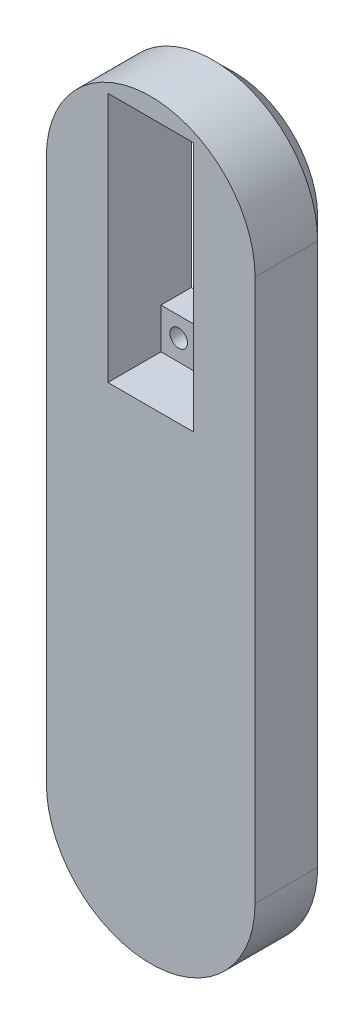
ISO-10303-21;
HEADER;
FILE_DESCRIPTION(('STEP AP214'),'2;1');
FILE_NAME('part.step','',(''),(''),'','','');
FILE_SCHEMA(('AUTOMOTIVE_DESIGN { 1 0 10303 214 1 1 1 1 }'));
ENDSEC;
DATA;
#1=APPLICATION_CONTEXT('core data for automotive mechanical design processes');
#2=APPLICATION_PROTOCOL_DEFINITION('international standard','automotive_design',2000,#1);
#3=PRODUCT_CONTEXT('',#1,'mechanical');
#4=PRODUCT('Part','Part','',(#3));
#5=PRODUCT_RELATED_PRODUCT_CATEGORY('part','',(#4));
#6=PRODUCT_DEFINITION_FORMATION('','',#4);
#7=PRODUCT_DEFINITION_CONTEXT('part definition',#1,'design');
#8=PRODUCT_DEFINITION('design','',#6,#7);
#9=PRODUCT_DEFINITION_SHAPE('','',#8);
#10=(LENGTH_UNIT() NAMED_UNIT(*) SI_UNIT(.MILLI.,.METRE.));
#11=(NAMED_UNIT(*) PLANE_ANGLE_UNIT() SI_UNIT($,.RADIAN.));
#12=(NAMED_UNIT(*) SI_UNIT($,.STERADIAN.) SOLID_ANGLE_UNIT());
#13=UNCERTAINTY_MEASURE_WITH_UNIT(LENGTH_MEASURE(1.E-05),#10,'distance_accuracy_value','');
#14=(GEOMETRIC_REPRESENTATION_CONTEXT(3) GLOBAL_UNCERTAINTY_ASSIGNED_CONTEXT((#13)) GLOBAL_UNIT_ASSIGNED_CONTEXT((#10,
#11,#12)) REPRESENTATION_CONTEXT('',''));
#15=CARTESIAN_POINT('',(0.,0.,0.));
#16=DIRECTION('',(0.,0.,1.));
#17=DIRECTION('',(1.,0.,0.));
#18=AXIS2_PLACEMENT_3D('',#15,#16,#17);
#19=CARTESIAN_POINT('',(-10.25,140.79,-2.7));
#20=DIRECTION('',(0.,1.,0.));
#21=DIRECTION('',(0.,0.,1.));
#22=AXIS2_PLACEMENT_3D('',#19,#20,#21);
#23=PLANE('',#22);
#24=DIRECTION('',(1.,0.,0.));
#25=VECTOR('',#24,1.);
#26=CARTESIAN_POINT('',(-10.25,140.79,-10.));
#27=LINE('',#26,#25);
#28=CARTESIAN_POINT('',(-10.25,140.79,-10.));
#29=VERTEX_POINT('',#28);
#30=CARTESIAN_POINT('',(-3.2,140.79,-10.));
#31=VERTEX_POINT('',#30);
#32=EDGE_CURVE('E186',#29,#31,#27,.T.);
#33=ORIENTED_EDGE('',*,*,#32,.T.);
#34=DIRECTION('',(0.,0.,1.));
#35=VECTOR('',#34,1.);
#36=CARTESIAN_POINT('',(-3.2,140.79,-2.7));
#37=LINE('',#36,#35);
#38=CARTESIAN_POINT('',(-3.2,140.79,-2.69999999999997));
#39=VERTEX_POINT('',#38);
#40=EDGE_CURVE('E12',#31,#39,#37,.T.);
#41=ORIENTED_EDGE('',*,*,#40,.T.);
#42=DIRECTION('',(1.,0.,0.));
#43=VECTOR('',#42,1.);
#44=CARTESIAN_POINT('',(-10.25,140.79,-2.7));
#45=LINE('',#44,#43);
#46=CARTESIAN_POINT('',(-10.25,140.79,-2.7));
#47=VERTEX_POINT('',#46);
#48=EDGE_CURVE('E183',#47,#39,#45,.T.);
#49=ORIENTED_EDGE('',*,*,#48,.F.);
#50=DIRECTION('',(0.,0.,1.));
#51=VECTOR('',#50,1.);
#52=CARTESIAN_POINT('',(-10.25,140.79,-2.7));
#53=LINE('',#52,#51);
#54=EDGE_CURVE('E283',#29,#47,#53,.T.);
#55=ORIENTED_EDGE('',*,*,#54,.F.);
#56=EDGE_LOOP('',(#33,#41,#49,#55));
#57=FACE_BOUND('',#56,.T.);
#58=ADVANCED_FACE('F43',(#57),#23,.F.);
#59=CARTESIAN_POINT('',(0.,130.,10.));
#60=DIRECTION('',(0.,0.,1.));
#61=DIRECTION('',(1.,0.,0.));
#62=AXIS2_PLACEMENT_3D('',#59,#60,#61);
#63=PLANE('',#62);
#64=CARTESIAN_POINT('',(0.,130.,10.));
#65=DIRECTION('',(0.,0.,1.));
#66=DIRECTION('',(1.,0.,0.));
#67=AXIS2_PLACEMENT_3D('',#64,#65,#66);
#68=CIRCLE('',#67,25.);
#69=CARTESIAN_POINT('',(25.,130.,10.));
#70=VERTEX_POINT('',#69);
#71=CARTESIAN_POINT('',(-25.,130.,10.));
#72=VERTEX_POINT('',#71);
#73=EDGE_CURVE('E199',#70,#72,#68,.T.);
#74=ORIENTED_EDGE('',*,*,#73,.T.);
#75=DIRECTION('',(0.,-1.,0.));
#76=VECTOR('',#75,1.);
#77=CARTESIAN_POINT('',(-25.,130.,10.));
#78=LINE('',#77,#76);
#79=CARTESIAN_POINT('',(-25.,0.,10.));
#80=VERTEX_POINT('',#79);
#81=EDGE_CURVE('E202',#72,#80,#78,.T.);
#82=ORIENTED_EDGE('',*,*,#81,.T.);
#83=CARTESIAN_POINT('',(0.,0.,10.));
#84=DIRECTION('',(0.,0.,1.));
#85=DIRECTION('',(1.,0.,0.));
#86=AXIS2_PLACEMENT_3D('',#83,#84,#85);
#87=CIRCLE('',#86,25.);
#88=CARTESIAN_POINT('',(25.,0.,10.));
#89=VERTEX_POINT('',#88);
#90=EDGE_CURVE('E205',#80,#89,#87,.T.);
#91=ORIENTED_EDGE('',*,*,#90,.T.);
#92=DIRECTION('',(0.,1.,0.));
#93=VECTOR('',#92,1.);
#94=CARTESIAN_POINT('',(25.,130.,10.));
#95=LINE('',#94,#93);
#96=EDGE_CURVE('E207',#89,#70,#95,.T.);
#97=ORIENTED_EDGE('',*,*,#96,.T.);
#98=EDGE_LOOP('',(#74,#82,#91,#97));
#99=FACE_BOUND('',#98,.T.);
#100=DIRECTION('',(1.,0.,0.));
#101=VECTOR('',#100,1.);
#102=CARTESIAN_POINT('',(-10.25,90.5,10.));
#103=LINE('',#102,#101);
#104=CARTESIAN_POINT('',(-10.25,90.5,10.));
#105=VERTEX_POINT('',#104);
#106=CARTESIAN_POINT('',(10.25,90.5,10.));
#107=VERTEX_POINT('',#106);
#108=EDGE_CURVE('E317',#105,#107,#103,.T.);
#109=ORIENTED_EDGE('',*,*,#108,.F.);
#110=DIRECTION('',(0.,-1.,0.));
#111=VECTOR('',#110,1.);
#112=CARTESIAN_POINT('',(-10.25,120.5,10.));
#113=LINE('',#112,#111);
#114=CARTESIAN_POINT('',(-10.25,150.5,10.));
#115=VERTEX_POINT('',#114);
#116=EDGE_CURVE('E296',#115,#105,#113,.T.);
#117=ORIENTED_EDGE('',*,*,#116,.F.);
#118=DIRECTION('',(1.,0.,0.));
#119=VECTOR('',#118,1.);
#120=CARTESIAN_POINT('',(-10.25,150.5,10.));
#121=LINE('',#120,#119);
#122=CARTESIAN_POINT('',(10.25,150.5,10.));
#123=VERTEX_POINT('',#122);
#124=EDGE_CURVE('E194',#115,#123,#121,.T.);
#125=ORIENTED_EDGE('',*,*,#124,.T.);
#126=DIRECTION('',(0.,-1.,0.));
#127=VECTOR('',#126,1.);
#128=CARTESIAN_POINT('',(10.25,120.5,10.));
#129=LINE('',#128,#127);
#130=EDGE_CURVE('E251',#123,#107,#129,.T.);
#131=ORIENTED_EDGE('',*,*,#130,.T.);
#132=EDGE_LOOP('',(#109,#117,#125,#131));
#133=FACE_BOUND('',#132,.T.);
#134=ADVANCED_FACE('F300',(#99,#133),#63,.T.);
#135=CARTESIAN_POINT('',(0.,130.,-10.));
#136=DIRECTION('',(0.,0.,1.));
#137=DIRECTION('',(1.,0.,0.));
#138=AXIS2_PLACEMENT_3D('',#135,#136,#137);
#139=PLANE('',#138);
#140=CARTESIAN_POINT('',(-6.,95.5,-10.));
#141=DIRECTION('',(0.,0.,1.));
#142=DIRECTION('',(1.,0.,0.));
#143=AXIS2_PLACEMENT_3D('',#140,#141,#142);
#144=CIRCLE('',#143,1.34999999999999);
#145=CARTESIAN_POINT('',(-4.65000000000001,95.5,-10.));
#146=VERTEX_POINT('',#145);
#147=EDGE_CURVE('E263',#146,#146,#144,.T.);
#148=ORIENTED_EDGE('',*,*,#147,.T.);
#149=EDGE_LOOP('',(#148));
#150=FACE_BOUND('',#149,.T.);
#151=CARTESIAN_POINT('',(6.,95.5,-10.));
#152=DIRECTION('',(0.,0.,1.));
#153=DIRECTION('',(1.,0.,0.));
#154=AXIS2_PLACEMENT_3D('',#151,#152,#153);
#155=CIRCLE('',#154,1.34999999999999);
#156=CARTESIAN_POINT('',(7.34999999999999,95.5,-10.));
#157=VERTEX_POINT('',#156);
#158=EDGE_CURVE('E258',#157,#157,#155,.T.);
#159=ORIENTED_EDGE('',*,*,#158,.T.);
#160=EDGE_LOOP('',(#159));
#161=FACE_BOUND('',#160,.T.);
#162=CARTESIAN_POINT('',(0.,0.,-10.));
#163=DIRECTION('',(0.,0.,1.));
#164=DIRECTION('',(1.,0.,0.));
#165=AXIS2_PLACEMENT_3D('',#162,#163,#164);
#166=CIRCLE('',#165,19.9999999999999);
#167=CARTESIAN_POINT('',(19.9999999999999,0.,-10.));
#168=VERTEX_POINT('',#167);
#169=CARTESIAN_POINT('',(-19.9999999999999,0.,-10.));
#170=VERTEX_POINT('',#169);
#171=EDGE_CURVE('E228',#168,#170,#166,.F.);
#172=ORIENTED_EDGE('',*,*,#171,.T.);
#173=DIRECTION('',(0.,1.,0.));
#174=VECTOR('',#173,1.);
#175=CARTESIAN_POINT('',(-19.9999999999999,130.,-10.));
#176=LINE('',#175,#174);
#177=CARTESIAN_POINT('',(-19.9999999999999,130.,-10.));
#178=VERTEX_POINT('',#177);
#179=EDGE_CURVE('E230',#170,#178,#176,.T.);
#180=ORIENTED_EDGE('',*,*,#179,.T.);
#181=CARTESIAN_POINT('',(0.,130.,-10.));
#182=DIRECTION('',(0.,0.,1.));
#183=DIRECTION('',(1.,0.,0.));
#184=AXIS2_PLACEMENT_3D('',#181,#182,#183);
#185=CIRCLE('',#184,19.9999999999999);
#186=CARTESIAN_POINT('',(19.9999999999999,130.,-10.));
#187=VERTEX_POINT('',#186);
#188=EDGE_CURVE('E224',#178,#187,#185,.F.);
#189=ORIENTED_EDGE('',*,*,#188,.T.);
#190=DIRECTION('',(0.,-1.,0.));
#191=VECTOR('',#190,1.);
#192=CARTESIAN_POINT('',(19.9999999999999,130.,-10.));
#193=LINE('',#192,#191);
#194=EDGE_CURVE('E226',#187,#168,#193,.T.);
#195=ORIENTED_EDGE('',*,*,#194,.T.);
#196=EDGE_LOOP('',(#172,#180,#189,#195));
#197=FACE_BOUND('',#196,.T.);
#198=CARTESIAN_POINT('',(-6.,145.5,-10.));
#199=DIRECTION('',(0.,0.,1.));
#200=DIRECTION('',(1.,0.,0.));
#201=AXIS2_PLACEMENT_3D('',#198,#199,#200);
#202=CIRCLE('',#201,1.34999999999999);
#203=CARTESIAN_POINT('',(-4.65000000000001,145.5,-10.));
#204=VERTEX_POINT('',#203);
#205=EDGE_CURVE('E248',#204,#204,#202,.T.);
#206=ORIENTED_EDGE('',*,*,#205,.T.);
#207=EDGE_LOOP('',(#206));
#208=FACE_BOUND('',#207,.T.);
#209=CARTESIAN_POINT('',(6.,145.5,-10.));
#210=DIRECTION('',(0.,0.,1.));
#211=DIRECTION('',(1.,0.,0.));
#212=AXIS2_PLACEMENT_3D('',#209,#210,#211);
#213=CIRCLE('',#212,1.34999999999999);
#214=CARTESIAN_POINT('',(7.34999999999999,145.5,-10.));
#215=VERTEX_POINT('',#214);
#216=EDGE_CURVE('E253',#215,#215,#213,.T.);
#217=ORIENTED_EDGE('',*,*,#216,.T.);
#218=EDGE_LOOP('',(#217));
#219=FACE_BOUND('',#218,.T.);
#220=DIRECTION('',(-1.,0.,0.));
#221=VECTOR('',#220,1.);
#222=CARTESIAN_POINT('',(0.,147.5,-10.));
#223=LINE('',#222,#221);
#224=CARTESIAN_POINT('',(3.2,147.5,-10.));
#225=VERTEX_POINT('',#224);
#226=CARTESIAN_POINT('',(-3.2,147.5,-10.));
#227=VERTEX_POINT('',#226);
#228=EDGE_CURVE('E354',#225,#227,#223,.T.);
#229=ORIENTED_EDGE('',*,*,#228,.T.);
#230=DIRECTION('',(0.,-1.,0.));
#231=VECTOR('',#230,1.);
#232=CARTESIAN_POINT('',(-3.2,130.,-10.));
#233=LINE('',#232,#231);
#234=EDGE_CURVE('E353',#227,#31,#233,.T.);
#235=ORIENTED_EDGE('',*,*,#234,.T.);
#236=ORIENTED_EDGE('',*,*,#32,.F.);
#237=DIRECTION('',(0.,1.,0.));
#238=VECTOR('',#237,1.);
#239=CARTESIAN_POINT('',(-10.25,140.79,-10.));
#240=LINE('',#239,#238);
#241=CARTESIAN_POINT('',(-10.25,100.21,-10.));
#242=VERTEX_POINT('',#241);
#243=EDGE_CURVE('E347',#242,#29,#240,.T.);
#244=ORIENTED_EDGE('',*,*,#243,.F.);
#245=DIRECTION('',(1.,0.,0.));
#246=VECTOR('',#245,1.);
#247=CARTESIAN_POINT('',(-10.25,100.21,-10.));
#248=LINE('',#247,#246);
#249=CARTESIAN_POINT('',(10.25,100.21,-10.));
#250=VERTEX_POINT('',#249);
#251=EDGE_CURVE('E334',#242,#250,#248,.T.);
#252=ORIENTED_EDGE('',*,*,#251,.T.);
#253=DIRECTION('',(0.,1.,0.));
#254=VECTOR('',#253,1.);
#255=CARTESIAN_POINT('',(10.25,140.79,-10.));
#256=LINE('',#255,#254);
#257=CARTESIAN_POINT('',(10.25,140.79,-10.));
#258=VERTEX_POINT('',#257);
#259=EDGE_CURVE('E276',#250,#258,#256,.T.);
#260=ORIENTED_EDGE('',*,*,#259,.T.);
#261=CARTESIAN_POINT('',(3.2,140.79,-10.));
#262=VERTEX_POINT('',#261);
#263=EDGE_CURVE('E66',#262,#258,#27,.T.);
#264=ORIENTED_EDGE('',*,*,#263,.F.);
#265=DIRECTION('',(0.,1.,0.));
#266=VECTOR('',#265,1.);
#267=CARTESIAN_POINT('',(3.2,130.,-10.));
#268=LINE('',#267,#266);
#269=EDGE_CURVE('E59',#262,#225,#268,.T.);
#270=ORIENTED_EDGE('',*,*,#269,.T.);
#271=EDGE_LOOP('',(#229,#235,#236,#244,#252,#260,#264,#270));
#272=FACE_BOUND('',#271,.T.);
#273=ADVANCED_FACE('F274',(#150,#161,#197,#208,#219,#272),#139,.F.);
#274=CARTESIAN_POINT('',(0.,130.,10.));
#275=DIRECTION('',(0.,0.,-1.));
#276=DIRECTION('',(-1.,0.,0.));
#277=AXIS2_PLACEMENT_3D('',#274,#275,#276);
#278=CYLINDRICAL_SURFACE('',#277,25.);
#279=DIRECTION('',(0.,0.,-1.));
#280=VECTOR('',#279,1.);
#281=CARTESIAN_POINT('',(25.,130.,10.));
#282=LINE('',#281,#280);
#283=CARTESIAN_POINT('',(25.,130.,-4.99999999999997));
#284=VERTEX_POINT('',#283);
#285=EDGE_CURVE('E209',#70,#284,#282,.T.);
#286=ORIENTED_EDGE('',*,*,#285,.T.);
#287=CARTESIAN_POINT('',(0.,130.,-4.99999999999997));
#288=DIRECTION('',(0.,0.,1.));
#289=DIRECTION('',(1.,0.,0.));
#290=AXIS2_PLACEMENT_3D('',#287,#288,#289);
#291=CIRCLE('',#290,25.);
#292=CARTESIAN_POINT('',(-25.,130.,-4.99999999999997));
#293=VERTEX_POINT('',#292);
#294=EDGE_CURVE('E237',#284,#293,#291,.T.);
#295=ORIENTED_EDGE('',*,*,#294,.T.);
#296=DIRECTION('',(0.,0.,-1.));
#297=VECTOR('',#296,1.);
#298=CARTESIAN_POINT('',(-25.,130.,10.));
#299=LINE('',#298,#297);
#300=EDGE_CURVE('E218',#72,#293,#299,.T.);
#301=ORIENTED_EDGE('',*,*,#300,.F.);
#302=ORIENTED_EDGE('',*,*,#73,.F.);
#303=EDGE_LOOP('',(#286,#295,#301,#302));
#304=FACE_BOUND('',#303,.T.);
#305=ADVANCED_FACE('F456',(#304),#278,.T.);
#306=CARTESIAN_POINT('',(-25.,130.,10.));
#307=DIRECTION('',(1.,0.,0.));
#308=DIRECTION('',(0.,1.,0.));
#309=AXIS2_PLACEMENT_3D('',#306,#307,#308);
#310=PLANE('',#309);
#311=ORIENTED_EDGE('',*,*,#300,.T.);
#312=DIRECTION('',(0.,-1.,0.));
#313=VECTOR('',#312,1.);
#314=CARTESIAN_POINT('',(-25.,130.,-4.99999999999997));
#315=LINE('',#314,#313);
#316=CARTESIAN_POINT('',(-25.,0.,-4.99999999999997));
#317=VERTEX_POINT('',#316);
#318=EDGE_CURVE('E221',#293,#317,#315,.T.);
#319=ORIENTED_EDGE('',*,*,#318,.T.);
#320=DIRECTION('',(0.,0.,-1.));
#321=VECTOR('',#320,1.);
#322=CARTESIAN_POINT('',(-25.,0.,10.));
#323=LINE('',#322,#321);
#324=EDGE_CURVE('E215',#80,#317,#323,.T.);
#325=ORIENTED_EDGE('',*,*,#324,.F.);
#326=ORIENTED_EDGE('',*,*,#81,.F.);
#327=EDGE_LOOP('',(#311,#319,#325,#326));
#328=FACE_BOUND('',#327,.T.);
#329=ADVANCED_FACE('F462',(#328),#310,.F.);
#330=CARTESIAN_POINT('',(0.,0.,10.));
#331=DIRECTION('',(0.,0.,-1.));
#332=DIRECTION('',(-1.,0.,0.));
#333=AXIS2_PLACEMENT_3D('',#330,#331,#332);
#334=CYLINDRICAL_SURFACE('',#333,25.);
#335=ORIENTED_EDGE('',*,*,#324,.T.);
#336=CARTESIAN_POINT('',(0.,0.,-4.99999999999997));
#337=DIRECTION('',(0.,0.,1.));
#338=DIRECTION('',(1.,0.,0.));
#339=AXIS2_PLACEMENT_3D('',#336,#337,#338);
#340=CIRCLE('',#339,25.);
#341=CARTESIAN_POINT('',(25.,0.,-4.99999999999997));
#342=VERTEX_POINT('',#341);
#343=EDGE_CURVE('E233',#317,#342,#340,.T.);
#344=ORIENTED_EDGE('',*,*,#343,.T.);
#345=DIRECTION('',(0.,0.,-1.));
#346=VECTOR('',#345,1.);
#347=CARTESIAN_POINT('',(25.,0.,10.));
#348=LINE('',#347,#346);
#349=EDGE_CURVE('E212',#89,#342,#348,.T.);
#350=ORIENTED_EDGE('',*,*,#349,.F.);
#351=ORIENTED_EDGE('',*,*,#90,.F.);
#352=EDGE_LOOP('',(#335,#344,#350,#351));
#353=FACE_BOUND('',#352,.T.);
#354=ADVANCED_FACE('F470',(#353),#334,.T.);
#355=CARTESIAN_POINT('',(25.,130.,10.));
#356=DIRECTION('',(-1.,0.,0.));
#357=DIRECTION('',(0.,-1.,0.));
#358=AXIS2_PLACEMENT_3D('',#355,#356,#357);
#359=PLANE('',#358);
#360=ORIENTED_EDGE('',*,*,#349,.T.);
#361=DIRECTION('',(0.,1.,0.));
#362=VECTOR('',#361,1.);
#363=CARTESIAN_POINT('',(25.,130.,-4.99999999999997));
#364=LINE('',#363,#362);
#365=EDGE_CURVE('E235',#342,#284,#364,.T.);
#366=ORIENTED_EDGE('',*,*,#365,.T.);
#367=ORIENTED_EDGE('',*,*,#285,.F.);
#368=ORIENTED_EDGE('',*,*,#96,.F.);
#369=EDGE_LOOP('',(#360,#366,#367,#368));
#370=FACE_BOUND('',#369,.T.);
#371=ADVANCED_FACE('F467',(#370),#359,.F.);
#372=CARTESIAN_POINT('',(25.,130.,-4.99999999999997));
#373=DIRECTION('',(-0.707106781186544,0.,0.707106781186551));
#374=DIRECTION('',(0.,1.,0.));
#375=AXIS2_PLACEMENT_3D('',#372,#373,#374);
#376=PLANE('',#375);
#377=DIRECTION('',(0.707106781186551,0.,0.707106781186544));
#378=VECTOR('',#377,1.);
#379=CARTESIAN_POINT('',(19.9999999999999,0.,-10.));
#380=LINE('',#379,#378);
#381=EDGE_CURVE('E243',#168,#342,#380,.T.);
#382=ORIENTED_EDGE('',*,*,#381,.F.);
#383=ORIENTED_EDGE('',*,*,#194,.F.);
#384=DIRECTION('',(-0.707106781186551,0.,-0.707106781186544));
#385=VECTOR('',#384,1.);
#386=CARTESIAN_POINT('',(25.,130.,-4.99999999999997));
#387=LINE('',#386,#385);
#388=EDGE_CURVE('E203',#284,#187,#387,.T.);
#389=ORIENTED_EDGE('',*,*,#388,.F.);
#390=ORIENTED_EDGE('',*,*,#365,.F.);
#391=EDGE_LOOP('',(#382,#383,#389,#390));
#392=FACE_BOUND('',#391,.T.);
#393=ADVANCED_FACE('F46',(#392),#376,.F.);
#394=CARTESIAN_POINT('',(0.,130.,-4.99999999999997));
#395=DIRECTION('',(0.,0.,1.));
#396=DIRECTION('',(1.,0.,0.));
#397=AXIS2_PLACEMENT_3D('',#394,#395,#396);
#398=CONICAL_SURFACE('',#397,25.,0.785398163397454);
#399=ORIENTED_EDGE('',*,*,#388,.T.);
#400=ORIENTED_EDGE('',*,*,#188,.F.);
#401=DIRECTION('',(0.707106781186551,0.,-0.707106781186544));
#402=VECTOR('',#401,1.);
#403=CARTESIAN_POINT('',(-25.,130.,-4.99999999999997));
#404=LINE('',#403,#402);
#405=EDGE_CURVE('E241',#293,#178,#404,.T.);
#406=ORIENTED_EDGE('',*,*,#405,.F.);
#407=ORIENTED_EDGE('',*,*,#294,.F.);
#408=EDGE_LOOP('',(#399,#400,#406,#407));
#409=FACE_BOUND('',#408,.T.);
#410=ADVANCED_FACE('F490',(#409),#398,.T.);
#411=CARTESIAN_POINT('',(0.,0.,-4.99999999999997));
#412=DIRECTION('',(0.,0.,1.));
#413=DIRECTION('',(1.,0.,0.));
#414=AXIS2_PLACEMENT_3D('',#411,#412,#413);
#415=CONICAL_SURFACE('',#414,25.,0.785398163397454);
#416=ORIENTED_EDGE('',*,*,#381,.T.);
#417=ORIENTED_EDGE('',*,*,#343,.F.);
#418=DIRECTION('',(-0.707106781186551,0.,0.707106781186544));
#419=VECTOR('',#418,1.);
#420=CARTESIAN_POINT('',(-19.9999999999999,0.,-10.));
#421=LINE('',#420,#419);
#422=EDGE_CURVE('E239',#170,#317,#421,.T.);
#423=ORIENTED_EDGE('',*,*,#422,.F.);
#424=ORIENTED_EDGE('',*,*,#171,.F.);
#425=EDGE_LOOP('',(#416,#417,#423,#424));
#426=FACE_BOUND('',#425,.T.);
#427=ADVANCED_FACE('F484',(#426),#415,.T.);
#428=CARTESIAN_POINT('',(-25.,130.,-4.99999999999997));
#429=DIRECTION('',(0.707106781186544,0.,0.707106781186551));
#430=DIRECTION('',(0.,-1.,0.));
#431=AXIS2_PLACEMENT_3D('',#428,#429,#430);
#432=PLANE('',#431);
#433=ORIENTED_EDGE('',*,*,#405,.T.);
#434=ORIENTED_EDGE('',*,*,#179,.F.);
#435=ORIENTED_EDGE('',*,*,#422,.T.);
#436=ORIENTED_EDGE('',*,*,#318,.F.);
#437=EDGE_LOOP('',(#433,#434,#435,#436));
#438=FACE_BOUND('',#437,.T.);
#439=ADVANCED_FACE('F421',(#438),#432,.F.);
#440=CARTESIAN_POINT('',(-10.25,150.5,-2.7));
#441=DIRECTION('',(0.,1.,0.));
#442=DIRECTION('',(0.,0.,1.));
#443=AXIS2_PLACEMENT_3D('',#440,#441,#442);
#444=PLANE('',#443);
#445=DIRECTION('',(0.,0.,1.));
#446=VECTOR('',#445,1.);
#447=CARTESIAN_POINT('',(10.25,150.5,-2.7));
#448=LINE('',#447,#446);
#449=CARTESIAN_POINT('',(10.25,150.5,-2.7));
#450=VERTEX_POINT('',#449);
#451=EDGE_CURVE('E294',#450,#123,#448,.T.);
#452=ORIENTED_EDGE('',*,*,#451,.T.);
#453=ORIENTED_EDGE('',*,*,#124,.F.);
#454=DIRECTION('',(0.,0.,1.));
#455=VECTOR('',#454,1.);
#456=CARTESIAN_POINT('',(-10.25,150.5,-2.7));
#457=LINE('',#456,#455);
#458=CARTESIAN_POINT('',(-10.25,150.5,-2.7));
#459=VERTEX_POINT('',#458);
#460=EDGE_CURVE('E277',#459,#115,#457,.T.);
#461=ORIENTED_EDGE('',*,*,#460,.F.);
#462=DIRECTION('',(1.,0.,0.));
#463=VECTOR('',#462,1.);
#464=CARTESIAN_POINT('',(-10.25,150.5,-2.7));
#465=LINE('',#464,#463);
#466=EDGE_CURVE('E191',#459,#450,#465,.T.);
#467=ORIENTED_EDGE('',*,*,#466,.T.);
#468=EDGE_LOOP('',(#452,#453,#461,#467));
#469=FACE_BOUND('',#468,.T.);
#470=ADVANCED_FACE('F303',(#469),#444,.F.);
#471=CARTESIAN_POINT('',(-10.25,140.79,-2.7));
#472=DIRECTION('',(0.,0.,-1.));
#473=DIRECTION('',(0.,1.,0.));
#474=AXIS2_PLACEMENT_3D('',#471,#472,#473);
#475=PLANE('',#474);
#476=CARTESIAN_POINT('',(6.,145.5,-2.69999999999999));
#477=DIRECTION('',(0.,0.,1.));
#478=DIRECTION('',(1.,0.,0.));
#479=AXIS2_PLACEMENT_3D('',#476,#477,#478);
#480=CIRCLE('',#479,2.09999999999999);
#481=CARTESIAN_POINT('',(8.09999999999999,145.5,-2.69999999999999));
#482=VERTEX_POINT('',#481);
#483=EDGE_CURVE('E257',#482,#482,#480,.T.);
#484=ORIENTED_EDGE('',*,*,#483,.F.);
#485=EDGE_LOOP('',(#484));
#486=FACE_BOUND('',#485,.T.);
#487=CARTESIAN_POINT('',(-6.,145.5,-2.69999999999999));
#488=DIRECTION('',(0.,0.,-1.));
#489=DIRECTION('',(-1.,0.,0.));
#490=AXIS2_PLACEMENT_3D('',#487,#488,#489);
#491=CIRCLE('',#490,2.09999999999999);
#492=CARTESIAN_POINT('',(-8.09999999999999,145.5,-2.69999999999999));
#493=VERTEX_POINT('',#492);
#494=EDGE_CURVE('E252',#493,#493,#491,.T.);
#495=ORIENTED_EDGE('',*,*,#494,.T.);
#496=EDGE_LOOP('',(#495));
#497=FACE_BOUND('',#496,.T.);
#498=ORIENTED_EDGE('',*,*,#48,.T.);
#499=DIRECTION('',(0.,-1.,0.));
#500=VECTOR('',#499,1.);
#501=CARTESIAN_POINT('',(-3.2,140.79,-2.69999999999997));
#502=LINE('',#501,#500);
#503=CARTESIAN_POINT('',(-3.2,147.5,-2.69999999999997));
#504=VERTEX_POINT('',#503);
#505=EDGE_CURVE('E170',#504,#39,#502,.T.);
#506=ORIENTED_EDGE('',*,*,#505,.F.);
#507=DIRECTION('',(-1.,0.,0.));
#508=VECTOR('',#507,1.);
#509=CARTESIAN_POINT('',(-3.2,147.5,-2.69999999999997));
#510=LINE('',#509,#508);
#511=CARTESIAN_POINT('',(3.2,147.5,-2.69999999999997));
#512=VERTEX_POINT('',#511);
#513=EDGE_CURVE('E727',#512,#504,#510,.T.);
#514=ORIENTED_EDGE('',*,*,#513,.F.);
#515=DIRECTION('',(0.,1.,0.));
#516=VECTOR('',#515,1.);
#517=CARTESIAN_POINT('',(3.2,140.79,-2.69999999999997));
#518=LINE('',#517,#516);
#519=CARTESIAN_POINT('',(3.2,140.79,-2.69999999999997));
#520=VERTEX_POINT('',#519);
#521=EDGE_CURVE('E179',#520,#512,#518,.T.);
#522=ORIENTED_EDGE('',*,*,#521,.F.);
#523=CARTESIAN_POINT('',(10.25,140.79,-2.7));
#524=VERTEX_POINT('',#523);
#525=EDGE_CURVE('E192',#520,#524,#45,.T.);
#526=ORIENTED_EDGE('',*,*,#525,.T.);
#527=DIRECTION('',(0.,1.,0.));
#528=VECTOR('',#527,1.);
#529=CARTESIAN_POINT('',(10.25,140.79,-2.7));
#530=LINE('',#529,#528);
#531=EDGE_CURVE('E291',#524,#450,#530,.T.);
#532=ORIENTED_EDGE('',*,*,#531,.T.);
#533=ORIENTED_EDGE('',*,*,#466,.F.);
#534=DIRECTION('',(0.,1.,0.));
#535=VECTOR('',#534,1.);
#536=CARTESIAN_POINT('',(-10.25,140.79,-2.7));
#537=LINE('',#536,#535);
#538=EDGE_CURVE('E189',#47,#459,#537,.T.);
#539=ORIENTED_EDGE('',*,*,#538,.F.);
#540=EDGE_LOOP('',(#498,#506,#514,#522,#526,#532,#533,#539));
#541=FACE_BOUND('',#540,.T.);
#542=ADVANCED_FACE('F187',(#486,#497,#541),#475,.F.);
#543=ORIENTED_EDGE('',*,*,#525,.F.);
#544=DIRECTION('',(0.,0.,-1.));
#545=VECTOR('',#544,1.);
#546=CARTESIAN_POINT('',(3.2,140.79,-2.7));
#547=LINE('',#546,#545);
#548=EDGE_CURVE('E52',#520,#262,#547,.T.);
#549=ORIENTED_EDGE('',*,*,#548,.T.);
#550=ORIENTED_EDGE('',*,*,#263,.T.);
#551=DIRECTION('',(0.,0.,1.));
#552=VECTOR('',#551,1.);
#553=CARTESIAN_POINT('',(10.25,140.79,-2.7));
#554=LINE('',#553,#552);
#555=EDGE_CURVE('E289',#258,#524,#554,.T.);
#556=ORIENTED_EDGE('',*,*,#555,.T.);
#557=EDGE_LOOP('',(#543,#549,#550,#556));
#558=FACE_BOUND('',#557,.T.);
#559=ADVANCED_FACE('F268',(#558),#23,.F.);
#560=CARTESIAN_POINT('',(-10.25,0.,0.));
#561=DIRECTION('',(1.,0.,0.));
#562=DIRECTION('',(0.,0.,-1.));
#563=AXIS2_PLACEMENT_3D('',#560,#561,#562);
#564=PLANE('',#563);
#565=ORIENTED_EDGE('',*,*,#116,.T.);
#566=DIRECTION('',(0.,0.,1.));
#567=VECTOR('',#566,1.);
#568=CARTESIAN_POINT('',(-10.25,90.5,-2.7));
#569=LINE('',#568,#567);
#570=CARTESIAN_POINT('',(-10.25,90.5,-2.7));
#571=VERTEX_POINT('',#570);
#572=EDGE_CURVE('E320',#571,#105,#569,.T.);
#573=ORIENTED_EDGE('',*,*,#572,.F.);
#574=DIRECTION('',(0.,-1.,0.));
#575=VECTOR('',#574,1.);
#576=CARTESIAN_POINT('',(-10.25,100.21,-2.7));
#577=LINE('',#576,#575);
#578=CARTESIAN_POINT('',(-10.25,100.21,-2.7));
#579=VERTEX_POINT('',#578);
#580=EDGE_CURVE('E326',#579,#571,#577,.T.);
#581=ORIENTED_EDGE('',*,*,#580,.F.);
#582=DIRECTION('',(0.,0.,1.));
#583=VECTOR('',#582,1.);
#584=CARTESIAN_POINT('',(-10.25,100.21,-2.7));
#585=LINE('',#584,#583);
#586=EDGE_CURVE('E322',#242,#579,#585,.T.);
#587=ORIENTED_EDGE('',*,*,#586,.F.);
#588=ORIENTED_EDGE('',*,*,#243,.T.);
#589=ORIENTED_EDGE('',*,*,#54,.T.);
#590=ORIENTED_EDGE('',*,*,#538,.T.);
#591=ORIENTED_EDGE('',*,*,#460,.T.);
#592=EDGE_LOOP('',(#565,#573,#581,#587,#588,#589,#590,#591));
#593=FACE_BOUND('',#592,.T.);
#594=ADVANCED_FACE('F349',(#593),#564,.T.);
#595=CARTESIAN_POINT('',(10.25,0.,0.));
#596=DIRECTION('',(1.,0.,0.));
#597=DIRECTION('',(0.,0.,-1.));
#598=AXIS2_PLACEMENT_3D('',#595,#596,#597);
#599=PLANE('',#598);
#600=ORIENTED_EDGE('',*,*,#130,.F.);
#601=ORIENTED_EDGE('',*,*,#451,.F.);
#602=ORIENTED_EDGE('',*,*,#531,.F.);
#603=ORIENTED_EDGE('',*,*,#555,.F.);
#604=ORIENTED_EDGE('',*,*,#259,.F.);
#605=DIRECTION('',(0.,0.,1.));
#606=VECTOR('',#605,1.);
#607=CARTESIAN_POINT('',(10.25,100.21,-2.7));
#608=LINE('',#607,#606);
#609=CARTESIAN_POINT('',(10.25,100.21,-2.7));
#610=VERTEX_POINT('',#609);
#611=EDGE_CURVE('E376',#250,#610,#608,.T.);
#612=ORIENTED_EDGE('',*,*,#611,.T.);
#613=DIRECTION('',(0.,-1.,0.));
#614=VECTOR('',#613,1.);
#615=CARTESIAN_POINT('',(10.25,100.21,-2.7));
#616=LINE('',#615,#614);
#617=CARTESIAN_POINT('',(10.25,90.5,-2.7));
#618=VERTEX_POINT('',#617);
#619=EDGE_CURVE('E311',#610,#618,#616,.T.);
#620=ORIENTED_EDGE('',*,*,#619,.T.);
#621=DIRECTION('',(0.,0.,1.));
#622=VECTOR('',#621,1.);
#623=CARTESIAN_POINT('',(10.25,90.5,-2.7));
#624=LINE('',#623,#622);
#625=EDGE_CURVE('E261',#618,#107,#624,.T.);
#626=ORIENTED_EDGE('',*,*,#625,.T.);
#627=EDGE_LOOP('',(#600,#601,#602,#603,#604,#612,#620,#626));
#628=FACE_BOUND('',#627,.T.);
#629=ADVANCED_FACE('F307',(#628),#599,.F.);
#630=CARTESIAN_POINT('',(-5.99999999999999,145.5,-58.1458184228832));
#631=DIRECTION('',(0.,0.,-1.));
#632=DIRECTION('',(-1.,0.,0.));
#633=AXIS2_PLACEMENT_3D('',#630,#631,#632);
#634=CYLINDRICAL_SURFACE('',#633,1.34999999999999);
#635=CARTESIAN_POINT('',(-6.,145.5,-8.69999999999999));
#636=DIRECTION('',(0.,0.,-1.));
#637=DIRECTION('',(-1.,0.,0.));
#638=AXIS2_PLACEMENT_3D('',#635,#636,#637);
#639=CIRCLE('',#638,1.34999999999999);
#640=CARTESIAN_POINT('',(-7.34999999999999,145.5,-8.69999999999999));
#641=VERTEX_POINT('',#640);
#642=EDGE_CURVE('E256',#641,#641,#639,.T.);
#643=ORIENTED_EDGE('',*,*,#642,.F.);
#644=EDGE_LOOP('',(#643));
#645=FACE_BOUND('',#644,.T.);
#646=ORIENTED_EDGE('',*,*,#205,.F.);
#647=EDGE_LOOP('',(#646));
#648=FACE_BOUND('',#647,.T.);
#649=ADVANCED_FACE('F427',(#645,#648),#634,.F.);
#650=CARTESIAN_POINT('',(-5.99999999999999,145.5,-58.1458184228832));
#651=DIRECTION('',(0.,0.,-1.));
#652=DIRECTION('',(-1.,0.,0.));
#653=AXIS2_PLACEMENT_3D('',#650,#651,#652);
#654=CYLINDRICAL_SURFACE('',#653,2.09999999999999);
#655=ORIENTED_EDGE('',*,*,#494,.F.);
#656=EDGE_LOOP('',(#655));
#657=FACE_BOUND('',#656,.T.);
#658=CARTESIAN_POINT('',(-6.,145.5,-8.69999999999999));
#659=DIRECTION('',(0.,0.,-1.));
#660=DIRECTION('',(-1.,0.,0.));
#661=AXIS2_PLACEMENT_3D('',#658,#659,#660);
#662=CIRCLE('',#661,2.09999999999999);
#663=CARTESIAN_POINT('',(-8.09999999999999,145.5,-8.69999999999999));
#664=VERTEX_POINT('',#663);
#665=EDGE_CURVE('E341',#664,#664,#662,.T.);
#666=ORIENTED_EDGE('',*,*,#665,.T.);
#667=EDGE_LOOP('',(#666));
#668=FACE_BOUND('',#667,.T.);
#669=ADVANCED_FACE('F429',(#657,#668),#654,.F.);
#670=CARTESIAN_POINT('',(-6.,147.6,-8.69999999999999));
#671=DIRECTION('',(0.,0.,-1.));
#672=DIRECTION('',(-1.,0.,0.));
#673=AXIS2_PLACEMENT_3D('',#670,#671,#672);
#674=PLANE('',#673);
#675=ORIENTED_EDGE('',*,*,#665,.F.);
#676=EDGE_LOOP('',(#675));
#677=FACE_BOUND('',#676,.T.);
#678=ORIENTED_EDGE('',*,*,#642,.T.);
#679=EDGE_LOOP('',(#678));
#680=FACE_BOUND('',#679,.T.);
#681=ADVANCED_FACE('F432',(#677,#680),#674,.F.);
#682=CARTESIAN_POINT('',(5.99999999999999,145.5,-58.1458184228832));
#683=DIRECTION('',(0.,0.,-1.));
#684=DIRECTION('',(1.,0.,0.));
#685=AXIS2_PLACEMENT_3D('',#682,#683,#684);
#686=CYLINDRICAL_SURFACE('',#685,1.34999999999999);
#687=CARTESIAN_POINT('',(6.,145.5,-8.69999999999999));
#688=DIRECTION('',(0.,0.,1.));
#689=DIRECTION('',(1.,0.,0.));
#690=AXIS2_PLACEMENT_3D('',#687,#688,#689);
#691=CIRCLE('',#690,1.34999999999999);
#692=CARTESIAN_POINT('',(7.34999999999999,145.5,-8.69999999999999));
#693=VERTEX_POINT('',#692);
#694=EDGE_CURVE('E330',#693,#693,#691,.T.);
#695=ORIENTED_EDGE('',*,*,#694,.T.);
#696=EDGE_LOOP('',(#695));
#697=FACE_BOUND('',#696,.T.);
#698=ORIENTED_EDGE('',*,*,#216,.F.);
#699=EDGE_LOOP('',(#698));
#700=FACE_BOUND('',#699,.T.);
#701=ADVANCED_FACE('F436',(#697,#700),#686,.F.);
#702=CARTESIAN_POINT('',(5.99999999999999,145.5,-58.1458184228832));
#703=DIRECTION('',(0.,0.,-1.));
#704=DIRECTION('',(1.,0.,0.));
#705=AXIS2_PLACEMENT_3D('',#702,#703,#704);
#706=CYLINDRICAL_SURFACE('',#705,2.09999999999999);
#707=ORIENTED_EDGE('',*,*,#483,.T.);
#708=EDGE_LOOP('',(#707));
#709=FACE_BOUND('',#708,.T.);
#710=CARTESIAN_POINT('',(6.,145.5,-8.69999999999999));
#711=DIRECTION('',(0.,0.,1.));
#712=DIRECTION('',(1.,0.,0.));
#713=AXIS2_PLACEMENT_3D('',#710,#711,#712);
#714=CIRCLE('',#713,2.09999999999999);
#715=CARTESIAN_POINT('',(8.09999999999999,145.5,-8.69999999999999));
#716=VERTEX_POINT('',#715);
#717=EDGE_CURVE('E333',#716,#716,#714,.T.);
#718=ORIENTED_EDGE('',*,*,#717,.F.);
#719=EDGE_LOOP('',(#718));
#720=FACE_BOUND('',#719,.T.);
#721=ADVANCED_FACE('F441',(#709,#720),#706,.F.);
#722=CARTESIAN_POINT('',(6.,147.6,-8.69999999999999));
#723=DIRECTION('',(0.,0.,-1.));
#724=DIRECTION('',(1.,0.,0.));
#725=AXIS2_PLACEMENT_3D('',#722,#723,#724);
#726=PLANE('',#725);
#727=ORIENTED_EDGE('',*,*,#717,.T.);
#728=EDGE_LOOP('',(#727));
#729=FACE_BOUND('',#728,.T.);
#730=ORIENTED_EDGE('',*,*,#694,.F.);
#731=EDGE_LOOP('',(#730));
#732=FACE_BOUND('',#731,.T.);
#733=ADVANCED_FACE('F396',(#729,#732),#726,.F.);
#734=CARTESIAN_POINT('',(-10.25,100.21,-2.7));
#735=DIRECTION('',(0.,1.,0.));
#736=DIRECTION('',(0.,0.,1.));
#737=AXIS2_PLACEMENT_3D('',#734,#735,#736);
#738=PLANE('',#737);
#739=ORIENTED_EDGE('',*,*,#611,.F.);
#740=ORIENTED_EDGE('',*,*,#251,.F.);
#741=ORIENTED_EDGE('',*,*,#586,.T.);
#742=DIRECTION('',(1.,0.,0.));
#743=VECTOR('',#742,1.);
#744=CARTESIAN_POINT('',(-10.25,100.21,-2.7));
#745=LINE('',#744,#743);
#746=EDGE_CURVE('E324',#579,#610,#745,.T.);
#747=ORIENTED_EDGE('',*,*,#746,.T.);
#748=EDGE_LOOP('',(#739,#740,#741,#747));
#749=FACE_BOUND('',#748,.T.);
#750=ADVANCED_FACE('F384',(#749),#738,.T.);
#751=CARTESIAN_POINT('',(-10.25,100.21,-2.7));
#752=DIRECTION('',(0.,0.,1.));
#753=DIRECTION('',(0.,-1.,0.));
#754=AXIS2_PLACEMENT_3D('',#751,#752,#753);
#755=PLANE('',#754);
#756=CARTESIAN_POINT('',(-6.,95.5,-2.69999999999999));
#757=DIRECTION('',(0.,0.,1.));
#758=DIRECTION('',(-1.,0.,0.));
#759=AXIS2_PLACEMENT_3D('',#756,#757,#758);
#760=CIRCLE('',#759,2.09999999999999);
#761=CARTESIAN_POINT('',(-8.09999999999999,95.5,-2.69999999999999));
#762=VERTEX_POINT('',#761);
#763=EDGE_CURVE('E266',#762,#762,#760,.T.);
#764=ORIENTED_EDGE('',*,*,#763,.F.);
#765=EDGE_LOOP('',(#764));
#766=FACE_BOUND('',#765,.T.);
#767=CARTESIAN_POINT('',(6.,95.5,-2.69999999999999));
#768=DIRECTION('',(0.,0.,-1.));
#769=DIRECTION('',(1.,0.,0.));
#770=AXIS2_PLACEMENT_3D('',#767,#768,#769);
#771=CIRCLE('',#770,2.09999999999999);
#772=CARTESIAN_POINT('',(8.09999999999999,95.5,-2.69999999999999));
#773=VERTEX_POINT('',#772);
#774=EDGE_CURVE('E262',#773,#773,#771,.T.);
#775=ORIENTED_EDGE('',*,*,#774,.T.);
#776=EDGE_LOOP('',(#775));
#777=FACE_BOUND('',#776,.T.);
#778=ORIENTED_EDGE('',*,*,#619,.F.);
#779=ORIENTED_EDGE('',*,*,#746,.F.);
#780=ORIENTED_EDGE('',*,*,#580,.T.);
#781=DIRECTION('',(1.,0.,0.));
#782=VECTOR('',#781,1.);
#783=CARTESIAN_POINT('',(-10.25,90.5,-2.7));
#784=LINE('',#783,#782);
#785=EDGE_CURVE('E321',#571,#618,#784,.T.);
#786=ORIENTED_EDGE('',*,*,#785,.T.);
#787=EDGE_LOOP('',(#778,#779,#780,#786));
#788=FACE_BOUND('',#787,.T.);
#789=ADVANCED_FACE('F386',(#766,#777,#788),#755,.T.);
#790=CARTESIAN_POINT('',(-10.25,90.5,-2.7));
#791=DIRECTION('',(0.,1.,0.));
#792=DIRECTION('',(0.,0.,1.));
#793=AXIS2_PLACEMENT_3D('',#790,#791,#792);
#794=PLANE('',#793);
#795=ORIENTED_EDGE('',*,*,#625,.F.);
#796=ORIENTED_EDGE('',*,*,#785,.F.);
#797=ORIENTED_EDGE('',*,*,#572,.T.);
#798=ORIENTED_EDGE('',*,*,#108,.T.);
#799=EDGE_LOOP('',(#795,#796,#797,#798));
#800=FACE_BOUND('',#799,.T.);
#801=ADVANCED_FACE('F318',(#800),#794,.T.);
#802=CARTESIAN_POINT('',(5.99999999999999,95.5,-58.1458184228832));
#803=DIRECTION('',(0.,0.,-1.));
#804=DIRECTION('',(1.,0.,0.));
#805=AXIS2_PLACEMENT_3D('',#802,#803,#804);
#806=CYLINDRICAL_SURFACE('',#805,1.34999999999999);
#807=CARTESIAN_POINT('',(6.,95.5,-8.69999999999999));
#808=DIRECTION('',(0.,0.,-1.));
#809=DIRECTION('',(1.,0.,0.));
#810=AXIS2_PLACEMENT_3D('',#807,#808,#809);
#811=CIRCLE('',#810,1.34999999999999);
#812=CARTESIAN_POINT('',(7.34999999999999,95.5,-8.69999999999999));
#813=VERTEX_POINT('',#812);
#814=EDGE_CURVE('E265',#813,#813,#811,.T.);
#815=ORIENTED_EDGE('',*,*,#814,.F.);
#816=EDGE_LOOP('',(#815));
#817=FACE_BOUND('',#816,.T.);
#818=ORIENTED_EDGE('',*,*,#158,.F.);
#819=EDGE_LOOP('',(#818));
#820=FACE_BOUND('',#819,.T.);
#821=ADVANCED_FACE('F394',(#817,#820),#806,.F.);
#822=CARTESIAN_POINT('',(5.99999999999999,95.5,-58.1458184228832));
#823=DIRECTION('',(0.,0.,-1.));
#824=DIRECTION('',(1.,0.,0.));
#825=AXIS2_PLACEMENT_3D('',#822,#823,#824);
#826=CYLINDRICAL_SURFACE('',#825,2.09999999999999);
#827=ORIENTED_EDGE('',*,*,#774,.F.);
#828=EDGE_LOOP('',(#827));
#829=FACE_BOUND('',#828,.T.);
#830=CARTESIAN_POINT('',(6.,95.5,-8.69999999999999));
#831=DIRECTION('',(0.,0.,-1.));
#832=DIRECTION('',(1.,0.,0.));
#833=AXIS2_PLACEMENT_3D('',#830,#831,#832);
#834=CIRCLE('',#833,2.09999999999999);
#835=CARTESIAN_POINT('',(8.09999999999999,95.5,-8.69999999999999));
#836=VERTEX_POINT('',#835);
#837=EDGE_CURVE('E370',#836,#836,#834,.T.);
#838=ORIENTED_EDGE('',*,*,#837,.T.);
#839=EDGE_LOOP('',(#838));
#840=FACE_BOUND('',#839,.T.);
#841=ADVANCED_FACE('F649',(#829,#840),#826,.F.);
#842=CARTESIAN_POINT('',(6.,93.4,-8.69999999999999));
#843=DIRECTION('',(0.,0.,-1.));
#844=DIRECTION('',(1.,0.,0.));
#845=AXIS2_PLACEMENT_3D('',#842,#843,#844);
#846=PLANE('',#845);
#847=ORIENTED_EDGE('',*,*,#837,.F.);
#848=EDGE_LOOP('',(#847));
#849=FACE_BOUND('',#848,.T.);
#850=ORIENTED_EDGE('',*,*,#814,.T.);
#851=EDGE_LOOP('',(#850));
#852=FACE_BOUND('',#851,.T.);
#853=ADVANCED_FACE('F658',(#849,#852),#846,.F.);
#854=CARTESIAN_POINT('',(-5.99999999999999,95.5,-58.1458184228832));
#855=DIRECTION('',(0.,0.,-1.));
#856=DIRECTION('',(-1.,0.,0.));
#857=AXIS2_PLACEMENT_3D('',#854,#855,#856);
#858=CYLINDRICAL_SURFACE('',#857,1.34999999999999);
#859=CARTESIAN_POINT('',(-6.,95.5,-8.69999999999999));
#860=DIRECTION('',(0.,0.,1.));
#861=DIRECTION('',(-1.,0.,0.));
#862=AXIS2_PLACEMENT_3D('',#859,#860,#861);
#863=CIRCLE('',#862,1.34999999999999);
#864=CARTESIAN_POINT('',(-7.34999999999999,95.5,-8.69999999999999));
#865=VERTEX_POINT('',#864);
#866=EDGE_CURVE('E356',#865,#865,#863,.T.);
#867=ORIENTED_EDGE('',*,*,#866,.T.);
#868=EDGE_LOOP('',(#867));
#869=FACE_BOUND('',#868,.T.);
#870=ORIENTED_EDGE('',*,*,#147,.F.);
#871=EDGE_LOOP('',(#870));
#872=FACE_BOUND('',#871,.T.);
#873=ADVANCED_FACE('F667',(#869,#872),#858,.F.);
#874=CARTESIAN_POINT('',(-5.99999999999999,95.5,-58.1458184228832));
#875=DIRECTION('',(0.,0.,-1.));
#876=DIRECTION('',(-1.,0.,0.));
#877=AXIS2_PLACEMENT_3D('',#874,#875,#876);
#878=CYLINDRICAL_SURFACE('',#877,2.09999999999999);
#879=ORIENTED_EDGE('',*,*,#763,.T.);
#880=EDGE_LOOP('',(#879));
#881=FACE_BOUND('',#880,.T.);
#882=CARTESIAN_POINT('',(-6.,95.5,-8.69999999999999));
#883=DIRECTION('',(0.,0.,1.));
#884=DIRECTION('',(-1.,0.,0.));
#885=AXIS2_PLACEMENT_3D('',#882,#883,#884);
#886=CIRCLE('',#885,2.09999999999999);
#887=CARTESIAN_POINT('',(-8.09999999999999,95.5,-8.69999999999999));
#888=VERTEX_POINT('',#887);
#889=EDGE_CURVE('E363',#888,#888,#886,.T.);
#890=ORIENTED_EDGE('',*,*,#889,.F.);
#891=EDGE_LOOP('',(#890));
#892=FACE_BOUND('',#891,.T.);
#893=ADVANCED_FACE('F676',(#881,#892),#878,.F.);
#894=CARTESIAN_POINT('',(-6.,93.4,-8.69999999999999));
#895=DIRECTION('',(0.,0.,-1.));
#896=DIRECTION('',(-1.,0.,0.));
#897=AXIS2_PLACEMENT_3D('',#894,#895,#896);
#898=PLANE('',#897);
#899=ORIENTED_EDGE('',*,*,#889,.T.);
#900=EDGE_LOOP('',(#899));
#901=FACE_BOUND('',#900,.T.);
#902=ORIENTED_EDGE('',*,*,#866,.F.);
#903=EDGE_LOOP('',(#902));
#904=FACE_BOUND('',#903,.T.);
#905=ADVANCED_FACE('F685',(#901,#904),#898,.F.);
#906=CARTESIAN_POINT('',(-3.2,147.5,-26.7));
#907=DIRECTION('',(0.,1.,0.));
#908=DIRECTION('',(0.,0.,1.));
#909=AXIS2_PLACEMENT_3D('',#906,#907,#908);
#910=PLANE('',#909);
#911=DIRECTION('',(0.,0.,1.));
#912=VECTOR('',#911,1.);
#913=CARTESIAN_POINT('',(3.2,147.5,-26.7));
#914=LINE('',#913,#912);
#915=EDGE_CURVE('E726',#225,#512,#914,.T.);
#916=ORIENTED_EDGE('',*,*,#915,.T.);
#917=ORIENTED_EDGE('',*,*,#513,.T.);
#918=DIRECTION('',(0.,0.,1.));
#919=VECTOR('',#918,1.);
#920=CARTESIAN_POINT('',(-3.2,147.5,-26.7));
#921=LINE('',#920,#919);
#922=EDGE_CURVE('E174',#227,#504,#921,.T.);
#923=ORIENTED_EDGE('',*,*,#922,.F.);
#924=ORIENTED_EDGE('',*,*,#228,.F.);
#925=EDGE_LOOP('',(#916,#917,#923,#924));
#926=FACE_BOUND('',#925,.T.);
#927=ADVANCED_FACE('F692',(#926),#910,.F.);
#928=CARTESIAN_POINT('',(-3.2,140.79,-26.7));
#929=DIRECTION('',(-1.,0.,0.));
#930=DIRECTION('',(0.,-1.,0.));
#931=AXIS2_PLACEMENT_3D('',#928,#929,#930);
#932=PLANE('',#931);
#933=ORIENTED_EDGE('',*,*,#922,.T.);
#934=ORIENTED_EDGE('',*,*,#505,.T.);
#935=ORIENTED_EDGE('',*,*,#40,.F.);
#936=ORIENTED_EDGE('',*,*,#234,.F.);
#937=EDGE_LOOP('',(#933,#934,#935,#936));
#938=FACE_BOUND('',#937,.T.);
#939=ADVANCED_FACE('F171',(#938),#932,.F.);
#940=CARTESIAN_POINT('',(3.2,140.79,-26.7));
#941=DIRECTION('',(1.,0.,0.));
#942=DIRECTION('',(0.,0.,-1.));
#943=AXIS2_PLACEMENT_3D('',#940,#941,#942);
#944=PLANE('',#943);
#945=ORIENTED_EDGE('',*,*,#548,.F.);
#946=ORIENTED_EDGE('',*,*,#521,.T.);
#947=ORIENTED_EDGE('',*,*,#915,.F.);
#948=ORIENTED_EDGE('',*,*,#269,.F.);
#949=EDGE_LOOP('',(#945,#946,#947,#948));
#950=FACE_BOUND('',#949,.T.);
#951=ADVANCED_FACE('F713',(#950),#944,.F.);
#952=CLOSED_SHELL('',(#58,#134,#273,#305,#329,#354,#371,#393,#410,#427,#439,#470,#542,#559,#594,
#629,#649,#669,#681,#701,#721,#733,#750,#789,#801,#821,#841,#853,#873,#893,#905,#927,#939,#951));
#953=MANIFOLD_SOLID_BREP('B2',#952);
#954=ADVANCED_BREP_SHAPE_REPRESENTATION('',(#18,#953),#14);
#955=SHAPE_DEFINITION_REPRESENTATION(#9,#954);
ENDSEC;
END-ISO-10303-21;
